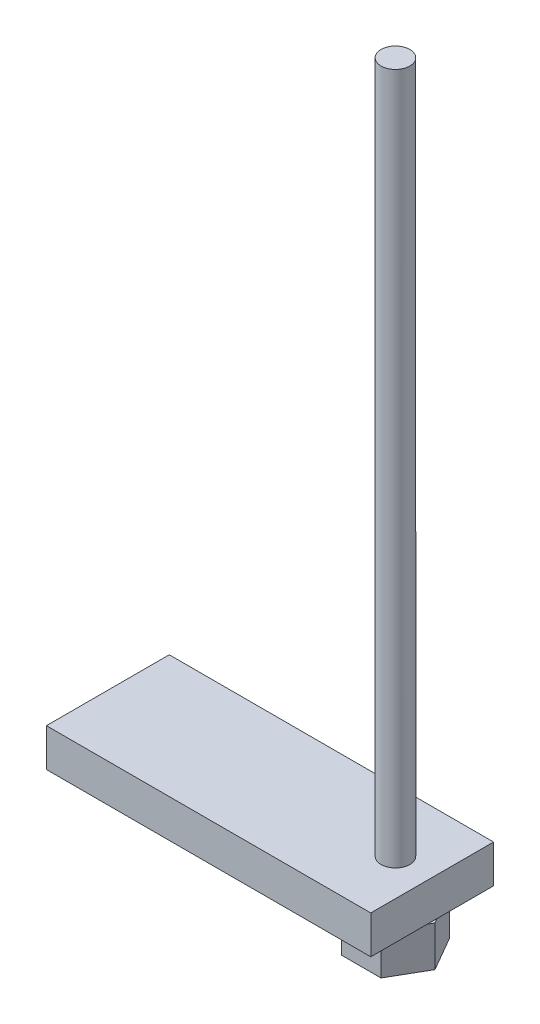
ISO-10303-21;
HEADER;
FILE_DESCRIPTION(('STEP AP214'),'2;1');
FILE_NAME('part.step','',(''),(''),'','','');
FILE_SCHEMA(('AUTOMOTIVE_DESIGN { 1 0 10303 214 1 1 1 1 }'));
ENDSEC;
DATA;
#1=APPLICATION_CONTEXT('core data for automotive mechanical design processes');
#2=APPLICATION_PROTOCOL_DEFINITION('international standard','automotive_design',2000,#1);
#3=PRODUCT_CONTEXT('',#1,'mechanical');
#4=PRODUCT('Part','Part','',(#3));
#5=PRODUCT_RELATED_PRODUCT_CATEGORY('part','',(#4));
#6=PRODUCT_DEFINITION_FORMATION('','',#4);
#7=PRODUCT_DEFINITION_CONTEXT('part definition',#1,'design');
#8=PRODUCT_DEFINITION('design','',#6,#7);
#9=PRODUCT_DEFINITION_SHAPE('','',#8);
#10=(LENGTH_UNIT() NAMED_UNIT(*) SI_UNIT(.MILLI.,.METRE.));
#11=(NAMED_UNIT(*) PLANE_ANGLE_UNIT() SI_UNIT($,.RADIAN.));
#12=(NAMED_UNIT(*) SI_UNIT($,.STERADIAN.) SOLID_ANGLE_UNIT());
#13=UNCERTAINTY_MEASURE_WITH_UNIT(LENGTH_MEASURE(1.E-05),#10,'distance_accuracy_value','');
#14=(GEOMETRIC_REPRESENTATION_CONTEXT(3) GLOBAL_UNCERTAINTY_ASSIGNED_CONTEXT((#13)) GLOBAL_UNIT_ASSIGNED_CONTEXT((#10,
#11,#12)) REPRESENTATION_CONTEXT('',''));
#15=CARTESIAN_POINT('',(0.,0.,0.));
#16=DIRECTION('',(0.,0.,1.));
#17=DIRECTION('',(1.,0.,0.));
#18=AXIS2_PLACEMENT_3D('',#15,#16,#17);
#19=CARTESIAN_POINT('',(33.8745,7.9375,12.828));
#20=DIRECTION('',(-1.,0.,0.));
#21=DIRECTION('',(0.,0.,1.));
#22=AXIS2_PLACEMENT_3D('',#19,#20,#21);
#23=PLANE('',#22);
#24=DIRECTION('',(0.,0.,-1.));
#25=VECTOR('',#24,1.);
#26=CARTESIAN_POINT('',(33.8745,0.,12.828));
#27=LINE('',#26,#25);
#28=CARTESIAN_POINT('',(33.8745,0.,12.828));
#29=VERTEX_POINT('',#28);
#30=CARTESIAN_POINT('',(33.8745,0.,1.01151767162023));
#31=VERTEX_POINT('',#30);
#32=EDGE_CURVE('E158',#29,#31,#27,.T.);
#33=ORIENTED_EDGE('',*,*,#32,.T.);
#34=CARTESIAN_POINT('',(33.8745,0.,-1.01151767162022));
#35=VERTEX_POINT('',#34);
#36=EDGE_CURVE('E162',#31,#35,#27,.T.);
#37=ORIENTED_EDGE('',*,*,#36,.T.);
#38=CARTESIAN_POINT('',(33.8745,0.,-12.828));
#39=VERTEX_POINT('',#38);
#40=EDGE_CURVE('E141',#35,#39,#27,.T.);
#41=ORIENTED_EDGE('',*,*,#40,.T.);
#42=DIRECTION('',(0.,-1.,0.));
#43=VECTOR('',#42,1.);
#44=CARTESIAN_POINT('',(33.8745,7.9375,-12.828));
#45=LINE('',#44,#43);
#46=CARTESIAN_POINT('',(33.8745,7.9375,-12.828));
#47=VERTEX_POINT('',#46);
#48=EDGE_CURVE('E174',#47,#39,#45,.T.);
#49=ORIENTED_EDGE('',*,*,#48,.F.);
#50=DIRECTION('',(0.,0.,-1.));
#51=VECTOR('',#50,1.);
#52=CARTESIAN_POINT('',(33.8745,7.9375,12.828));
#53=LINE('',#52,#51);
#54=CARTESIAN_POINT('',(33.8745,7.9375,12.828));
#55=VERTEX_POINT('',#54);
#56=EDGE_CURVE('E147',#55,#47,#53,.T.);
#57=ORIENTED_EDGE('',*,*,#56,.F.);
#58=DIRECTION('',(0.,-1.,0.));
#59=VECTOR('',#58,1.);
#60=CARTESIAN_POINT('',(33.8745,7.9375,12.828));
#61=LINE('',#60,#59);
#62=EDGE_CURVE('E157',#55,#29,#61,.T.);
#63=ORIENTED_EDGE('',*,*,#62,.T.);
#64=EDGE_LOOP('',(#33,#37,#41,#49,#57,#63));
#65=FACE_BOUND('',#64,.T.);
#66=ADVANCED_FACE('F33',(#65),#23,.F.);
#67=CARTESIAN_POINT('',(-33.8745,7.9375,-12.828));
#68=DIRECTION('',(0.,0.,1.));
#69=DIRECTION('',(1.,0.,0.));
#70=AXIS2_PLACEMENT_3D('',#67,#68,#69);
#71=PLANE('',#70);
#72=DIRECTION('',(-1.,0.,0.));
#73=VECTOR('',#72,1.);
#74=CARTESIAN_POINT('',(-33.8745,0.,-12.828));
#75=LINE('',#74,#73);
#76=CARTESIAN_POINT('',(-33.8745,0.,-12.828));
#77=VERTEX_POINT('',#76);
#78=EDGE_CURVE('E161',#39,#77,#75,.T.);
#79=ORIENTED_EDGE('',*,*,#78,.T.);
#80=DIRECTION('',(0.,-1.,0.));
#81=VECTOR('',#80,1.);
#82=CARTESIAN_POINT('',(-33.8745,7.9375,-12.828));
#83=LINE('',#82,#81);
#84=CARTESIAN_POINT('',(-33.8745,7.9375,-12.828));
#85=VERTEX_POINT('',#84);
#86=EDGE_CURVE('E172',#85,#77,#83,.T.);
#87=ORIENTED_EDGE('',*,*,#86,.F.);
#88=DIRECTION('',(-1.,0.,0.));
#89=VECTOR('',#88,1.);
#90=CARTESIAN_POINT('',(-33.8745,7.9375,-12.828));
#91=LINE('',#90,#89);
#92=EDGE_CURVE('E150',#47,#85,#91,.T.);
#93=ORIENTED_EDGE('',*,*,#92,.F.);
#94=ORIENTED_EDGE('',*,*,#48,.T.);
#95=EDGE_LOOP('',(#79,#87,#93,#94));
#96=FACE_BOUND('',#95,.T.);
#97=ADVANCED_FACE('F200',(#96),#71,.F.);
#98=CARTESIAN_POINT('',(-33.8745,7.9375,12.828));
#99=DIRECTION('',(1.,0.,0.));
#100=DIRECTION('',(0.,0.,-1.));
#101=AXIS2_PLACEMENT_3D('',#98,#99,#100);
#102=PLANE('',#101);
#103=DIRECTION('',(0.,0.,1.));
#104=VECTOR('',#103,1.);
#105=CARTESIAN_POINT('',(-33.8745,0.,12.828));
#106=LINE('',#105,#104);
#107=CARTESIAN_POINT('',(-33.8745,0.,12.828));
#108=VERTEX_POINT('',#107);
#109=EDGE_CURVE('E164',#77,#108,#106,.T.);
#110=ORIENTED_EDGE('',*,*,#109,.T.);
#111=DIRECTION('',(0.,-1.,0.));
#112=VECTOR('',#111,1.);
#113=CARTESIAN_POINT('',(-33.8745,7.9375,12.828));
#114=LINE('',#113,#112);
#115=CARTESIAN_POINT('',(-33.8745,7.9375,12.828));
#116=VERTEX_POINT('',#115);
#117=EDGE_CURVE('E169',#116,#108,#114,.T.);
#118=ORIENTED_EDGE('',*,*,#117,.F.);
#119=DIRECTION('',(0.,0.,1.));
#120=VECTOR('',#119,1.);
#121=CARTESIAN_POINT('',(-33.8745,7.9375,12.828));
#122=LINE('',#121,#120);
#123=EDGE_CURVE('E153',#85,#116,#122,.T.);
#124=ORIENTED_EDGE('',*,*,#123,.F.);
#125=ORIENTED_EDGE('',*,*,#86,.T.);
#126=EDGE_LOOP('',(#110,#118,#124,#125));
#127=FACE_BOUND('',#126,.T.);
#128=ADVANCED_FACE('F203',(#127),#102,.F.);
#129=CARTESIAN_POINT('',(-33.8745,7.9375,12.828));
#130=DIRECTION('',(0.,0.,-1.));
#131=DIRECTION('',(-1.,0.,0.));
#132=AXIS2_PLACEMENT_3D('',#129,#130,#131);
#133=PLANE('',#132);
#134=DIRECTION('',(1.,0.,0.));
#135=VECTOR('',#134,1.);
#136=CARTESIAN_POINT('',(-33.8745,0.,12.828));
#137=LINE('',#136,#135);
#138=EDGE_CURVE('E151',#108,#29,#137,.T.);
#139=ORIENTED_EDGE('',*,*,#138,.T.);
#140=ORIENTED_EDGE('',*,*,#62,.F.);
#141=DIRECTION('',(1.,0.,0.));
#142=VECTOR('',#141,1.);
#143=CARTESIAN_POINT('',(-33.8745,7.9375,12.828));
#144=LINE('',#143,#142);
#145=EDGE_CURVE('E155',#116,#55,#144,.T.);
#146=ORIENTED_EDGE('',*,*,#145,.F.);
#147=ORIENTED_EDGE('',*,*,#117,.T.);
#148=EDGE_LOOP('',(#139,#140,#146,#147));
#149=FACE_BOUND('',#148,.T.);
#150=ADVANCED_FACE('F187',(#149),#133,.F.);
#151=CARTESIAN_POINT('',(0.,7.9375,0.));
#152=DIRECTION('',(0.,-1.,0.));
#153=DIRECTION('',(0.,0.,-1.));
#154=AXIS2_PLACEMENT_3D('',#151,#152,#153);
#155=PLANE('',#154);
#156=CARTESIAN_POINT('',(26.2085,7.93749999999999,0.));
#157=DIRECTION('',(0.,-1.,0.));
#158=DIRECTION('',(0.,0.,-1.));
#159=AXIS2_PLACEMENT_3D('',#156,#157,#158);
#160=CIRCLE('',#159,2.99999999999999);
#161=CARTESIAN_POINT('',(26.2085,7.93749999999999,-2.99999999999999));
#162=VERTEX_POINT('',#161);
#163=EDGE_CURVE('E36',#162,#162,#160,.F.);
#164=ORIENTED_EDGE('',*,*,#163,.F.);
#165=EDGE_LOOP('',(#164));
#166=FACE_BOUND('',#165,.T.);
#167=ORIENTED_EDGE('',*,*,#56,.T.);
#168=ORIENTED_EDGE('',*,*,#92,.T.);
#169=ORIENTED_EDGE('',*,*,#123,.T.);
#170=ORIENTED_EDGE('',*,*,#145,.T.);
#171=EDGE_LOOP('',(#167,#168,#169,#170));
#172=FACE_BOUND('',#171,.T.);
#173=ADVANCED_FACE('F183',(#166,#172),#155,.F.);
#174=CARTESIAN_POINT('',(0.,0.,0.));
#175=DIRECTION('',(0.,-1.,0.));
#176=DIRECTION('',(0.,0.,-1.));
#177=AXIS2_PLACEMENT_3D('',#174,#175,#176);
#178=PLANE('',#177);
#179=DIRECTION('',(-0.5,0.,0.866025403784439));
#180=VECTOR('',#179,1.);
#181=CARTESIAN_POINT('',(34.4585,0.,0.));
#182=LINE('',#181,#180);
#183=CARTESIAN_POINT('',(30.3335,0.,7.14470958122162));
#184=VERTEX_POINT('',#183);
#185=EDGE_CURVE('E11',#31,#184,#182,.T.);
#186=ORIENTED_EDGE('',*,*,#185,.F.);
#187=ORIENTED_EDGE('',*,*,#32,.F.);
#188=ORIENTED_EDGE('',*,*,#138,.F.);
#189=ORIENTED_EDGE('',*,*,#109,.F.);
#190=ORIENTED_EDGE('',*,*,#78,.F.);
#191=ORIENTED_EDGE('',*,*,#40,.F.);
#192=DIRECTION('',(0.5,0.,0.866025403784439));
#193=VECTOR('',#192,1.);
#194=CARTESIAN_POINT('',(30.3335,0.,-7.14470958122162));
#195=LINE('',#194,#193);
#196=CARTESIAN_POINT('',(30.3335,0.,-7.14470958122162));
#197=VERTEX_POINT('',#196);
#198=EDGE_CURVE('E230',#197,#35,#195,.T.);
#199=ORIENTED_EDGE('',*,*,#198,.F.);
#200=DIRECTION('',(1.,0.,0.));
#201=VECTOR('',#200,1.);
#202=CARTESIAN_POINT('',(22.0835,0.,-7.14470958122162));
#203=LINE('',#202,#201);
#204=CARTESIAN_POINT('',(22.0835,0.,-7.14470958122162));
#205=VERTEX_POINT('',#204);
#206=EDGE_CURVE('E234',#205,#197,#203,.T.);
#207=ORIENTED_EDGE('',*,*,#206,.F.);
#208=DIRECTION('',(0.5,0.,-0.866025403784438));
#209=VECTOR('',#208,1.);
#210=CARTESIAN_POINT('',(17.9585,0.,0.));
#211=LINE('',#210,#209);
#212=CARTESIAN_POINT('',(17.9585,0.,0.));
#213=VERTEX_POINT('',#212);
#214=EDGE_CURVE('E137',#213,#205,#211,.T.);
#215=ORIENTED_EDGE('',*,*,#214,.F.);
#216=DIRECTION('',(-0.5,0.,-0.866025403784438));
#217=VECTOR('',#216,1.);
#218=CARTESIAN_POINT('',(22.0835,0.,7.14470958122162));
#219=LINE('',#218,#217);
#220=CARTESIAN_POINT('',(22.0835,0.,7.14470958122162));
#221=VERTEX_POINT('',#220);
#222=EDGE_CURVE('E53',#221,#213,#219,.T.);
#223=ORIENTED_EDGE('',*,*,#222,.F.);
#224=DIRECTION('',(-1.,0.,0.));
#225=VECTOR('',#224,1.);
#226=CARTESIAN_POINT('',(30.3335,0.,7.14470958122162));
#227=LINE('',#226,#225);
#228=EDGE_CURVE('E49',#184,#221,#227,.T.);
#229=ORIENTED_EDGE('',*,*,#228,.F.);
#230=EDGE_LOOP('',(#186,#187,#188,#189,#190,#191,#199,#207,#215,#223,#229));
#231=FACE_BOUND('',#230,.T.);
#232=ADVANCED_FACE('F186',(#231),#178,.T.);
#233=CARTESIAN_POINT('',(26.2085,152.4,0.));
#234=DIRECTION('',(0.,-1.,0.));
#235=DIRECTION('',(0.,0.,-1.));
#236=AXIS2_PLACEMENT_3D('',#233,#234,#235);
#237=CYLINDRICAL_SURFACE('',#236,2.99999999999999);
#238=CARTESIAN_POINT('',(26.2085,152.4,0.));
#239=DIRECTION('',(0.,1.,0.));
#240=DIRECTION('',(0.,0.,1.));
#241=AXIS2_PLACEMENT_3D('',#238,#239,#240);
#242=CIRCLE('',#241,2.99999999999999);
#243=CARTESIAN_POINT('',(26.2085,152.4,2.99999999999999));
#244=VERTEX_POINT('',#243);
#245=EDGE_CURVE('E138',#244,#244,#242,.T.);
#246=ORIENTED_EDGE('',*,*,#245,.F.);
#247=EDGE_LOOP('',(#246));
#248=FACE_BOUND('',#247,.T.);
#249=ORIENTED_EDGE('',*,*,#163,.T.);
#250=EDGE_LOOP('',(#249));
#251=FACE_BOUND('',#250,.T.);
#252=ADVANCED_FACE('F181',(#248,#251),#237,.T.);
#253=CARTESIAN_POINT('',(26.2085,152.4,0.));
#254=DIRECTION('',(0.,1.,0.));
#255=DIRECTION('',(0.,0.,1.));
#256=AXIS2_PLACEMENT_3D('',#253,#254,#255);
#257=PLANE('',#256);
#258=ORIENTED_EDGE('',*,*,#245,.T.);
#259=EDGE_LOOP('',(#258));
#260=FACE_BOUND('',#259,.T.);
#261=ADVANCED_FACE('F272',(#260),#257,.T.);
#262=CARTESIAN_POINT('',(17.9585,-8.448,0.));
#263=DIRECTION('',(0.866025403784439,0.,0.5));
#264=DIRECTION('',(0.5,0.,-0.866025403784438));
#265=AXIS2_PLACEMENT_3D('',#262,#263,#264);
#266=PLANE('',#265);
#267=ORIENTED_EDGE('',*,*,#214,.T.);
#268=DIRECTION('',(0.,1.,0.));
#269=VECTOR('',#268,1.);
#270=CARTESIAN_POINT('',(22.0835,-8.448,-7.14470958122162));
#271=LINE('',#270,#269);
#272=CARTESIAN_POINT('',(22.0835,-8.448,-7.14470958122162));
#273=VERTEX_POINT('',#272);
#274=EDGE_CURVE('E119',#273,#205,#271,.T.);
#275=ORIENTED_EDGE('',*,*,#274,.F.);
#276=DIRECTION('',(0.5,0.,-0.866025403784438));
#277=VECTOR('',#276,1.);
#278=CARTESIAN_POINT('',(17.9585,-8.448,0.));
#279=LINE('',#278,#277);
#280=CARTESIAN_POINT('',(17.9585,-8.448,0.));
#281=VERTEX_POINT('',#280);
#282=EDGE_CURVE('E126',#281,#273,#279,.T.);
#283=ORIENTED_EDGE('',*,*,#282,.F.);
#284=DIRECTION('',(0.,1.,0.));
#285=VECTOR('',#284,1.);
#286=CARTESIAN_POINT('',(17.9585,-8.448,0.));
#287=LINE('',#286,#285);
#288=EDGE_CURVE('E224',#281,#213,#287,.T.);
#289=ORIENTED_EDGE('',*,*,#288,.T.);
#290=EDGE_LOOP('',(#267,#275,#283,#289));
#291=FACE_BOUND('',#290,.T.);
#292=ADVANCED_FACE('F136',(#291),#266,.F.);
#293=CARTESIAN_POINT('',(22.0835,-8.448,-7.14470958122162));
#294=DIRECTION('',(0.,0.,1.));
#295=DIRECTION('',(1.,0.,0.));
#296=AXIS2_PLACEMENT_3D('',#293,#294,#295);
#297=PLANE('',#296);
#298=ORIENTED_EDGE('',*,*,#206,.T.);
#299=DIRECTION('',(0.,1.,0.));
#300=VECTOR('',#299,1.);
#301=CARTESIAN_POINT('',(30.3335,-8.448,-7.14470958122162));
#302=LINE('',#301,#300);
#303=CARTESIAN_POINT('',(30.3335,-8.448,-7.14470958122162));
#304=VERTEX_POINT('',#303);
#305=EDGE_CURVE('E122',#304,#197,#302,.T.);
#306=ORIENTED_EDGE('',*,*,#305,.F.);
#307=DIRECTION('',(1.,0.,0.));
#308=VECTOR('',#307,1.);
#309=CARTESIAN_POINT('',(22.0835,-8.448,-7.14470958122162));
#310=LINE('',#309,#308);
#311=EDGE_CURVE('E114',#273,#304,#310,.T.);
#312=ORIENTED_EDGE('',*,*,#311,.F.);
#313=ORIENTED_EDGE('',*,*,#274,.T.);
#314=EDGE_LOOP('',(#298,#306,#312,#313));
#315=FACE_BOUND('',#314,.T.);
#316=ADVANCED_FACE('F117',(#315),#297,.F.);
#317=CARTESIAN_POINT('',(30.3335,-8.448,-7.14470958122162));
#318=DIRECTION('',(-0.866025403784439,0.,0.5));
#319=DIRECTION('',(0.5,0.,0.866025403784439));
#320=AXIS2_PLACEMENT_3D('',#317,#318,#319);
#321=PLANE('',#320);
#322=ORIENTED_EDGE('',*,*,#198,.T.);
#323=CARTESIAN_POINT('',(34.4585,0.,0.));
#324=VERTEX_POINT('',#323);
#325=EDGE_CURVE('E233',#35,#324,#195,.T.);
#326=ORIENTED_EDGE('',*,*,#325,.T.);
#327=DIRECTION('',(0.,1.,0.));
#328=VECTOR('',#327,1.);
#329=CARTESIAN_POINT('',(34.4585,-8.448,0.));
#330=LINE('',#329,#328);
#331=CARTESIAN_POINT('',(34.4585,-8.448,0.));
#332=VERTEX_POINT('',#331);
#333=EDGE_CURVE('E143',#332,#324,#330,.T.);
#334=ORIENTED_EDGE('',*,*,#333,.F.);
#335=DIRECTION('',(0.5,0.,0.866025403784439));
#336=VECTOR('',#335,1.);
#337=CARTESIAN_POINT('',(30.3335,-8.448,-7.14470958122162));
#338=LINE('',#337,#336);
#339=EDGE_CURVE('E125',#304,#332,#338,.T.);
#340=ORIENTED_EDGE('',*,*,#339,.F.);
#341=ORIENTED_EDGE('',*,*,#305,.T.);
#342=EDGE_LOOP('',(#322,#326,#334,#340,#341));
#343=FACE_BOUND('',#342,.T.);
#344=ADVANCED_FACE('F243',(#343),#321,.F.);
#345=CARTESIAN_POINT('',(34.4585,-8.448,0.));
#346=DIRECTION('',(-0.866025403784439,0.,-0.5));
#347=DIRECTION('',(-0.5,0.,0.866025403784439));
#348=AXIS2_PLACEMENT_3D('',#345,#346,#347);
#349=PLANE('',#348);
#350=EDGE_CURVE('E42',#324,#31,#182,.T.);
#351=ORIENTED_EDGE('',*,*,#350,.T.);
#352=ORIENTED_EDGE('',*,*,#185,.T.);
#353=DIRECTION('',(0.,1.,0.));
#354=VECTOR('',#353,1.);
#355=CARTESIAN_POINT('',(30.3335,-8.448,7.14470958122162));
#356=LINE('',#355,#354);
#357=CARTESIAN_POINT('',(30.3335,-8.448,7.14470958122162));
#358=VERTEX_POINT('',#357);
#359=EDGE_CURVE('E213',#358,#184,#356,.T.);
#360=ORIENTED_EDGE('',*,*,#359,.F.);
#361=DIRECTION('',(-0.5,0.,0.866025403784439));
#362=VECTOR('',#361,1.);
#363=CARTESIAN_POINT('',(34.4585,-8.448,0.));
#364=LINE('',#363,#362);
#365=EDGE_CURVE('E239',#332,#358,#364,.T.);
#366=ORIENTED_EDGE('',*,*,#365,.F.);
#367=ORIENTED_EDGE('',*,*,#333,.T.);
#368=EDGE_LOOP('',(#351,#352,#360,#366,#367));
#369=FACE_BOUND('',#368,.T.);
#370=ADVANCED_FACE('F211',(#369),#349,.F.);
#371=CARTESIAN_POINT('',(30.3335,-8.448,7.14470958122162));
#372=DIRECTION('',(0.,0.,-1.));
#373=DIRECTION('',(-1.,0.,0.));
#374=AXIS2_PLACEMENT_3D('',#371,#372,#373);
#375=PLANE('',#374);
#376=ORIENTED_EDGE('',*,*,#228,.T.);
#377=DIRECTION('',(0.,1.,0.));
#378=VECTOR('',#377,1.);
#379=CARTESIAN_POINT('',(22.0835,-8.448,7.14470958122162));
#380=LINE('',#379,#378);
#381=CARTESIAN_POINT('',(22.0835,-8.448,7.14470958122162));
#382=VERTEX_POINT('',#381);
#383=EDGE_CURVE('E222',#382,#221,#380,.T.);
#384=ORIENTED_EDGE('',*,*,#383,.F.);
#385=DIRECTION('',(-1.,0.,0.));
#386=VECTOR('',#385,1.);
#387=CARTESIAN_POINT('',(30.3335,-8.448,7.14470958122162));
#388=LINE('',#387,#386);
#389=EDGE_CURVE('E221',#358,#382,#388,.T.);
#390=ORIENTED_EDGE('',*,*,#389,.F.);
#391=ORIENTED_EDGE('',*,*,#359,.T.);
#392=EDGE_LOOP('',(#376,#384,#390,#391));
#393=FACE_BOUND('',#392,.T.);
#394=ADVANCED_FACE('F218',(#393),#375,.F.);
#395=CARTESIAN_POINT('',(22.0835,-8.448,7.14470958122162));
#396=DIRECTION('',(0.866025403784438,0.,-0.5));
#397=DIRECTION('',(-0.5,0.,-0.866025403784439));
#398=AXIS2_PLACEMENT_3D('',#395,#396,#397);
#399=PLANE('',#398);
#400=ORIENTED_EDGE('',*,*,#222,.T.);
#401=ORIENTED_EDGE('',*,*,#288,.F.);
#402=DIRECTION('',(-0.5,0.,-0.866025403784438));
#403=VECTOR('',#402,1.);
#404=CARTESIAN_POINT('',(22.0835,-8.448,7.14470958122162));
#405=LINE('',#404,#403);
#406=EDGE_CURVE('E131',#382,#281,#405,.T.);
#407=ORIENTED_EDGE('',*,*,#406,.F.);
#408=ORIENTED_EDGE('',*,*,#383,.T.);
#409=EDGE_LOOP('',(#400,#401,#407,#408));
#410=FACE_BOUND('',#409,.T.);
#411=ADVANCED_FACE('F247',(#410),#399,.F.);
#412=CARTESIAN_POINT('',(0.,-8.448,0.));
#413=DIRECTION('',(0.,-1.,0.));
#414=DIRECTION('',(0.,0.,-1.));
#415=AXIS2_PLACEMENT_3D('',#412,#413,#414);
#416=PLANE('',#415);
#417=ORIENTED_EDGE('',*,*,#282,.T.);
#418=ORIENTED_EDGE('',*,*,#311,.T.);
#419=ORIENTED_EDGE('',*,*,#339,.T.);
#420=ORIENTED_EDGE('',*,*,#365,.T.);
#421=ORIENTED_EDGE('',*,*,#389,.T.);
#422=ORIENTED_EDGE('',*,*,#406,.T.);
#423=EDGE_LOOP('',(#417,#418,#419,#420,#421,#422));
#424=FACE_BOUND('',#423,.T.);
#425=ADVANCED_FACE('F129',(#424),#416,.T.);
#426=CARTESIAN_POINT('',(0.,0.,0.));
#427=DIRECTION('',(0.,-1.,0.));
#428=DIRECTION('',(0.,0.,-1.));
#429=AXIS2_PLACEMENT_3D('',#426,#427,#428);
#430=PLANE('',#429);
#431=ORIENTED_EDGE('',*,*,#36,.F.);
#432=ORIENTED_EDGE('',*,*,#350,.F.);
#433=ORIENTED_EDGE('',*,*,#325,.F.);
#434=EDGE_LOOP('',(#431,#432,#433));
#435=FACE_BOUND('',#434,.T.);
#436=ADVANCED_FACE('F245',(#435),#430,.F.);
#437=CLOSED_SHELL('',(#66,#97,#128,#150,#173,#232,#252,#261,#292,#316,#344,#370,#394,#411,#425,#436));
#438=MANIFOLD_SOLID_BREP('B2',#437);
#439=ADVANCED_BREP_SHAPE_REPRESENTATION('',(#18,#438),#14);
#440=SHAPE_DEFINITION_REPRESENTATION(#9,#439);
ENDSEC;
END-ISO-10303-21;
